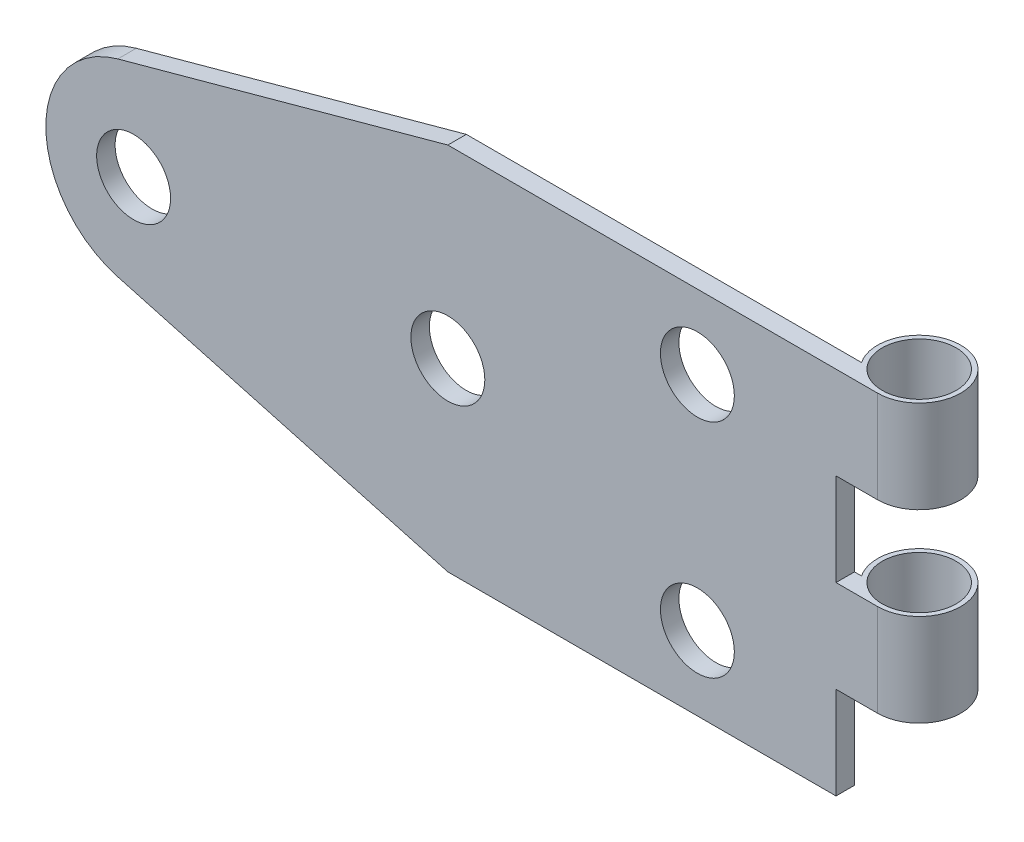
ISO-10303-21;
HEADER;
FILE_DESCRIPTION(('STEP AP214'),'2;1');
FILE_NAME('part.step','',(''),(''),'','','');
FILE_SCHEMA(('AUTOMOTIVE_DESIGN { 1 0 10303 214 1 1 1 1 }'));
ENDSEC;
DATA;
#1=APPLICATION_CONTEXT('core data for automotive mechanical design processes');
#2=APPLICATION_PROTOCOL_DEFINITION('international standard','automotive_design',2000,#1);
#3=PRODUCT_CONTEXT('',#1,'mechanical');
#4=PRODUCT('Part','Part','',(#3));
#5=PRODUCT_RELATED_PRODUCT_CATEGORY('part','',(#4));
#6=PRODUCT_DEFINITION_FORMATION('','',#4);
#7=PRODUCT_DEFINITION_CONTEXT('part definition',#1,'design');
#8=PRODUCT_DEFINITION('design','',#6,#7);
#9=PRODUCT_DEFINITION_SHAPE('','',#8);
#10=(LENGTH_UNIT() NAMED_UNIT(*) SI_UNIT(.MILLI.,.METRE.));
#11=(NAMED_UNIT(*) PLANE_ANGLE_UNIT() SI_UNIT($,.RADIAN.));
#12=(NAMED_UNIT(*) SI_UNIT($,.STERADIAN.) SOLID_ANGLE_UNIT());
#13=UNCERTAINTY_MEASURE_WITH_UNIT(LENGTH_MEASURE(1.E-05),#10,'distance_accuracy_value','');
#14=(GEOMETRIC_REPRESENTATION_CONTEXT(3) GLOBAL_UNCERTAINTY_ASSIGNED_CONTEXT((#13)) GLOBAL_UNIT_ASSIGNED_CONTEXT((#10,
#11,#12)) REPRESENTATION_CONTEXT('',''));
#15=CARTESIAN_POINT('',(0.,0.,0.));
#16=DIRECTION('',(0.,0.,1.));
#17=DIRECTION('',(1.,0.,0.));
#18=AXIS2_PLACEMENT_3D('',#15,#16,#17);
#19=CARTESIAN_POINT('',(0.,0.,2.));
#20=DIRECTION('',(0.,0.,1.));
#21=DIRECTION('',(1.,0.,0.));
#22=AXIS2_PLACEMENT_3D('',#19,#20,#21);
#23=PLANE('',#22);
#24=CARTESIAN_POINT('',(-19.5,12.,2.));
#25=DIRECTION('',(0.,0.,1.));
#26=DIRECTION('',(1.,0.,0.));
#27=AXIS2_PLACEMENT_3D('',#24,#25,#26);
#28=CIRCLE('',#27,4.);
#29=CARTESIAN_POINT('',(-15.5,12.,2.));
#30=VERTEX_POINT('',#29);
#31=EDGE_CURVE('E172',#30,#30,#28,.T.);
#32=ORIENTED_EDGE('',*,*,#31,.F.);
#33=EDGE_LOOP('',(#32));
#34=FACE_BOUND('',#33,.T.);
#35=CARTESIAN_POINT('',(-46.5,0.,2.));
#36=DIRECTION('',(0.,0.,1.));
#37=DIRECTION('',(1.,0.,0.));
#38=AXIS2_PLACEMENT_3D('',#35,#36,#37);
#39=CIRCLE('',#38,4.00000000000001);
#40=CARTESIAN_POINT('',(-42.5,0.,2.));
#41=VERTEX_POINT('',#40);
#42=EDGE_CURVE('E178',#41,#41,#39,.T.);
#43=ORIENTED_EDGE('',*,*,#42,.F.);
#44=EDGE_LOOP('',(#43));
#45=FACE_BOUND('',#44,.T.);
#46=CARTESIAN_POINT('',(-80.5,0.,2.));
#47=DIRECTION('',(0.,0.,1.));
#48=DIRECTION('',(1.,0.,0.));
#49=AXIS2_PLACEMENT_3D('',#46,#47,#48);
#50=CIRCLE('',#49,4.00000000000001);
#51=CARTESIAN_POINT('',(-76.5,0.,2.));
#52=VERTEX_POINT('',#51);
#53=EDGE_CURVE('E173',#52,#52,#50,.T.);
#54=ORIENTED_EDGE('',*,*,#53,.F.);
#55=EDGE_LOOP('',(#54));
#56=FACE_BOUND('',#55,.T.);
#57=CARTESIAN_POINT('',(-19.5,-12.,2.));
#58=DIRECTION('',(0.,0.,1.));
#59=DIRECTION('',(1.,0.,0.));
#60=AXIS2_PLACEMENT_3D('',#57,#58,#59);
#61=CIRCLE('',#60,4.);
#62=CARTESIAN_POINT('',(-15.5,-12.,2.));
#63=VERTEX_POINT('',#62);
#64=EDGE_CURVE('E180',#63,#63,#61,.T.);
#65=ORIENTED_EDGE('',*,*,#64,.F.);
#66=EDGE_LOOP('',(#65));
#67=FACE_BOUND('',#66,.T.);
#68=DIRECTION('',(-1.,0.,0.));
#69=VECTOR('',#68,1.);
#70=CARTESIAN_POINT('',(-4.5,-10.,2.));
#71=LINE('',#70,#69);
#72=CARTESIAN_POINT('',(0.,-10.,2.));
#73=VERTEX_POINT('',#72);
#74=CARTESIAN_POINT('',(-4.5,-10.,2.));
#75=VERTEX_POINT('',#74);
#76=EDGE_CURVE('E189',#73,#75,#71,.T.);
#77=ORIENTED_EDGE('',*,*,#76,.F.);
#78=DIRECTION('',(0.,-1.,0.));
#79=VECTOR('',#78,1.);
#80=CARTESIAN_POINT('',(0.,20.,2.));
#81=LINE('',#80,#79);
#82=CARTESIAN_POINT('',(0.,0.,2.));
#83=VERTEX_POINT('',#82);
#84=EDGE_CURVE('E166',#83,#73,#81,.T.);
#85=ORIENTED_EDGE('',*,*,#84,.F.);
#86=DIRECTION('',(1.,0.,0.));
#87=VECTOR('',#86,1.);
#88=CARTESIAN_POINT('',(-4.5,0.,2.));
#89=LINE('',#88,#87);
#90=CARTESIAN_POINT('',(-4.5,0.,2.));
#91=VERTEX_POINT('',#90);
#92=EDGE_CURVE('E160',#91,#83,#89,.T.);
#93=ORIENTED_EDGE('',*,*,#92,.F.);
#94=DIRECTION('',(0.,-1.,0.));
#95=VECTOR('',#94,1.);
#96=CARTESIAN_POINT('',(-4.5,10.,2.));
#97=LINE('',#96,#95);
#98=CARTESIAN_POINT('',(-4.5,10.,2.));
#99=VERTEX_POINT('',#98);
#100=EDGE_CURVE('E150',#99,#91,#97,.T.);
#101=ORIENTED_EDGE('',*,*,#100,.F.);
#102=DIRECTION('',(-1.,0.,0.));
#103=VECTOR('',#102,1.);
#104=CARTESIAN_POINT('',(0.,10.,2.));
#105=LINE('',#104,#103);
#106=CARTESIAN_POINT('',(0.,10.,2.));
#107=VERTEX_POINT('',#106);
#108=EDGE_CURVE('E156',#107,#99,#105,.T.);
#109=ORIENTED_EDGE('',*,*,#108,.F.);
#110=CARTESIAN_POINT('',(0.,20.,2.));
#111=VERTEX_POINT('',#110);
#112=EDGE_CURVE('E219',#111,#107,#81,.T.);
#113=ORIENTED_EDGE('',*,*,#112,.F.);
#114=DIRECTION('',(-1.,0.,0.));
#115=VECTOR('',#114,1.);
#116=CARTESIAN_POINT('',(0.,20.,2.));
#117=LINE('',#116,#115);
#118=CARTESIAN_POINT('',(-46.5,20.,2.));
#119=VERTEX_POINT('',#118);
#120=EDGE_CURVE('E61',#111,#119,#117,.T.);
#121=ORIENTED_EDGE('',*,*,#120,.T.);
#122=DIRECTION('',(-0.964424622842345,-0.264357989959452,0.));
#123=VECTOR('',#122,1.);
#124=CARTESIAN_POINT('',(-8.34872642401626,30.4576280593252,2.));
#125=LINE('',#124,#123);
#126=CARTESIAN_POINT('',(-82.2110801063892,10.2112522507119,2.));
#127=VERTEX_POINT('',#126);
#128=EDGE_CURVE('E224',#119,#127,#125,.T.);
#129=ORIENTED_EDGE('',*,*,#128,.T.);
#130=CARTESIAN_POINT('',(-79.4120784467143,0.,2.));
#131=DIRECTION('',(0.,0.,1.));
#132=DIRECTION('',(1.,0.,0.));
#133=AXIS2_PLACEMENT_3D('',#130,#131,#132);
#134=CIRCLE('',#133,10.5879215532857);
#135=CARTESIAN_POINT('',(-82.2110801063892,-10.2112522507119,2.));
#136=VERTEX_POINT('',#135);
#137=EDGE_CURVE('E97',#127,#136,#134,.T.);
#138=ORIENTED_EDGE('',*,*,#137,.T.);
#139=DIRECTION('',(-0.964424622842345,0.264357989959451,0.));
#140=VECTOR('',#139,1.);
#141=CARTESIAN_POINT('',(-8.34872642401625,-30.4576280593252,2.));
#142=LINE('',#141,#140);
#143=CARTESIAN_POINT('',(-46.5,-20.,2.));
#144=VERTEX_POINT('',#143);
#145=EDGE_CURVE('E226',#144,#136,#142,.T.);
#146=ORIENTED_EDGE('',*,*,#145,.F.);
#147=DIRECTION('',(-1.,0.,0.));
#148=VECTOR('',#147,1.);
#149=CARTESIAN_POINT('',(0.,-20.,2.));
#150=LINE('',#149,#148);
#151=CARTESIAN_POINT('',(-4.5,-20.,2.));
#152=VERTEX_POINT('',#151);
#153=EDGE_CURVE('E233',#152,#144,#150,.T.);
#154=ORIENTED_EDGE('',*,*,#153,.F.);
#155=DIRECTION('',(0.,-1.,0.));
#156=VECTOR('',#155,1.);
#157=CARTESIAN_POINT('',(-4.5,-20.,2.));
#158=LINE('',#157,#156);
#159=EDGE_CURVE('E187',#75,#152,#158,.T.);
#160=ORIENTED_EDGE('',*,*,#159,.F.);
#161=EDGE_LOOP('',(#77,#85,#93,#101,#109,#113,#121,#129,#138,#146,#154,#160));
#162=FACE_BOUND('',#161,.T.);
#163=ADVANCED_FACE('F44',(#34,#45,#56,#67,#162),#23,.T.);
#164=CARTESIAN_POINT('',(0.,20.,-2.5));
#165=DIRECTION('',(0.,-1.,0.));
#166=DIRECTION('',(0.,0.,-1.));
#167=AXIS2_PLACEMENT_3D('',#164,#165,#166);
#168=CYLINDRICAL_SURFACE('',#167,4.5);
#169=CARTESIAN_POINT('',(0.,-10.,-2.5));
#170=DIRECTION('',(0.,-1.,0.));
#171=DIRECTION('',(0.,0.,-1.));
#172=AXIS2_PLACEMENT_3D('',#169,#170,#171);
#173=CIRCLE('',#172,4.5);
#174=CARTESIAN_POINT('',(-3.74165738677394,-10.,0.));
#175=VERTEX_POINT('',#174);
#176=EDGE_CURVE('E205',#175,#73,#173,.T.);
#177=ORIENTED_EDGE('',*,*,#176,.F.);
#178=DIRECTION('',(0.,-1.,0.));
#179=VECTOR('',#178,1.);
#180=CARTESIAN_POINT('',(-3.74165738677394,20.,0.));
#181=LINE('',#180,#179);
#182=CARTESIAN_POINT('',(-3.74165738677394,0.,0.));
#183=VERTEX_POINT('',#182);
#184=EDGE_CURVE('E216',#183,#175,#181,.T.);
#185=ORIENTED_EDGE('',*,*,#184,.F.);
#186=CARTESIAN_POINT('',(0.,0.,-2.5));
#187=DIRECTION('',(0.,1.,0.));
#188=DIRECTION('',(0.,0.,1.));
#189=AXIS2_PLACEMENT_3D('',#186,#187,#188);
#190=CIRCLE('',#189,4.5);
#191=EDGE_CURVE('E197',#83,#183,#190,.T.);
#192=ORIENTED_EDGE('',*,*,#191,.F.);
#193=ORIENTED_EDGE('',*,*,#84,.T.);
#194=EDGE_LOOP('',(#177,#185,#192,#193));
#195=FACE_BOUND('',#194,.T.);
#196=ADVANCED_FACE('F294',(#195),#168,.T.);
#197=CARTESIAN_POINT('',(0.,10.,-2.5));
#198=DIRECTION('',(0.,-1.,0.));
#199=DIRECTION('',(1.,0.,0.));
#200=AXIS2_PLACEMENT_3D('',#197,#198,#199);
#201=CIRCLE('',#200,4.5);
#202=CARTESIAN_POINT('',(-3.74165738677394,10.,0.));
#203=VERTEX_POINT('',#202);
#204=EDGE_CURVE('E194',#203,#107,#201,.T.);
#205=ORIENTED_EDGE('',*,*,#204,.F.);
#206=CARTESIAN_POINT('',(-3.74165738677394,20.,0.));
#207=VERTEX_POINT('',#206);
#208=EDGE_CURVE('E221',#207,#203,#181,.T.);
#209=ORIENTED_EDGE('',*,*,#208,.F.);
#210=CARTESIAN_POINT('',(0.,20.,-2.5));
#211=DIRECTION('',(0.,1.,0.));
#212=DIRECTION('',(0.,0.,1.));
#213=AXIS2_PLACEMENT_3D('',#210,#211,#212);
#214=CIRCLE('',#213,4.5);
#215=EDGE_CURVE('E213',#111,#207,#214,.T.);
#216=ORIENTED_EDGE('',*,*,#215,.F.);
#217=ORIENTED_EDGE('',*,*,#112,.T.);
#218=EDGE_LOOP('',(#205,#209,#216,#217));
#219=FACE_BOUND('',#218,.T.);
#220=ADVANCED_FACE('F305',(#219),#168,.T.);
#221=CARTESIAN_POINT('',(0.,20.,-2.5));
#222=DIRECTION('',(0.,-1.,0.));
#223=DIRECTION('',(0.,0.,-1.));
#224=AXIS2_PLACEMENT_3D('',#221,#222,#223);
#225=CYLINDRICAL_SURFACE('',#224,4.);
#226=CARTESIAN_POINT('',(0.,20.,-2.5));
#227=DIRECTION('',(0.,1.,0.));
#228=DIRECTION('',(0.,0.,1.));
#229=AXIS2_PLACEMENT_3D('',#226,#227,#228);
#230=CIRCLE('',#229,4.);
#231=CARTESIAN_POINT('',(0.,20.,1.5));
#232=VERTEX_POINT('',#231);
#233=EDGE_CURVE('E215',#232,#232,#230,.T.);
#234=ORIENTED_EDGE('',*,*,#233,.T.);
#235=EDGE_LOOP('',(#234));
#236=FACE_BOUND('',#235,.T.);
#237=CARTESIAN_POINT('',(0.,10.,-2.5));
#238=DIRECTION('',(0.,-1.,0.));
#239=DIRECTION('',(1.,0.,0.));
#240=AXIS2_PLACEMENT_3D('',#237,#238,#239);
#241=CIRCLE('',#240,4.);
#242=CARTESIAN_POINT('',(4.,10.,-2.5));
#243=VERTEX_POINT('',#242);
#244=EDGE_CURVE('E195',#243,#243,#241,.T.);
#245=ORIENTED_EDGE('',*,*,#244,.T.);
#246=EDGE_LOOP('',(#245));
#247=FACE_BOUND('',#246,.T.);
#248=ADVANCED_FACE('F325',(#236,#247),#225,.F.);
#249=CARTESIAN_POINT('',(-8.34872642401626,30.4576280593252,2.));
#250=DIRECTION('',(0.264357989959452,-0.964424622842345,0.));
#251=DIRECTION('',(0.964424622842345,0.264357989959452,0.));
#252=AXIS2_PLACEMENT_3D('',#249,#250,#251);
#253=PLANE('',#252);
#254=DIRECTION('',(-0.964424622842345,-0.264357989959452,0.));
#255=VECTOR('',#254,1.);
#256=CARTESIAN_POINT('',(-8.34872642401626,30.4576280593252,0.));
#257=LINE('',#256,#255);
#258=CARTESIAN_POINT('',(-46.5,20.,0.));
#259=VERTEX_POINT('',#258);
#260=CARTESIAN_POINT('',(-82.2110801063892,10.2112522507119,0.));
#261=VERTEX_POINT('',#260);
#262=EDGE_CURVE('E222',#259,#261,#257,.T.);
#263=ORIENTED_EDGE('',*,*,#262,.T.);
#264=DIRECTION('',(0.,0.,-1.));
#265=VECTOR('',#264,1.);
#266=CARTESIAN_POINT('',(-82.2110801063892,10.2112522507119,2.));
#267=LINE('',#266,#265);
#268=EDGE_CURVE('E11',#127,#261,#267,.T.);
#269=ORIENTED_EDGE('',*,*,#268,.F.);
#270=ORIENTED_EDGE('',*,*,#128,.F.);
#271=DIRECTION('',(0.,0.,-1.));
#272=VECTOR('',#271,1.);
#273=CARTESIAN_POINT('',(-46.5,20.,2.));
#274=LINE('',#273,#272);
#275=EDGE_CURVE('E234',#119,#259,#274,.T.);
#276=ORIENTED_EDGE('',*,*,#275,.T.);
#277=EDGE_LOOP('',(#263,#269,#270,#276));
#278=FACE_BOUND('',#277,.T.);
#279=ADVANCED_FACE('F50',(#278),#253,.F.);
#280=CARTESIAN_POINT('',(-79.4120784467143,0.,2.));
#281=DIRECTION('',(0.,0.,-1.));
#282=DIRECTION('',(-1.,0.,0.));
#283=AXIS2_PLACEMENT_3D('',#280,#281,#282);
#284=CYLINDRICAL_SURFACE('',#283,10.5879215532857);
#285=CARTESIAN_POINT('',(-79.4120784467143,0.,0.));
#286=DIRECTION('',(0.,0.,1.));
#287=DIRECTION('',(1.,0.,0.));
#288=AXIS2_PLACEMENT_3D('',#285,#286,#287);
#289=CIRCLE('',#288,10.5879215532857);
#290=CARTESIAN_POINT('',(-82.2110801063892,-10.2112522507119,0.));
#291=VERTEX_POINT('',#290);
#292=EDGE_CURVE('E240',#261,#291,#289,.T.);
#293=ORIENTED_EDGE('',*,*,#292,.T.);
#294=DIRECTION('',(0.,0.,-1.));
#295=VECTOR('',#294,1.);
#296=CARTESIAN_POINT('',(-82.2110801063892,-10.2112522507119,2.));
#297=LINE('',#296,#295);
#298=EDGE_CURVE('E54',#136,#291,#297,.T.);
#299=ORIENTED_EDGE('',*,*,#298,.F.);
#300=ORIENTED_EDGE('',*,*,#137,.F.);
#301=ORIENTED_EDGE('',*,*,#268,.T.);
#302=EDGE_LOOP('',(#293,#299,#300,#301));
#303=FACE_BOUND('',#302,.T.);
#304=ADVANCED_FACE('F317',(#303),#284,.T.);
#305=CARTESIAN_POINT('',(-8.34872642401625,-30.4576280593252,2.));
#306=DIRECTION('',(-0.264357989959451,-0.964424622842345,0.));
#307=DIRECTION('',(0.964424622842345,-0.264357989959451,0.));
#308=AXIS2_PLACEMENT_3D('',#305,#306,#307);
#309=PLANE('',#308);
#310=DIRECTION('',(-0.964424622842345,0.264357989959451,0.));
#311=VECTOR('',#310,1.);
#312=CARTESIAN_POINT('',(-8.34872642401625,-30.4576280593252,0.));
#313=LINE('',#312,#311);
#314=CARTESIAN_POINT('',(-46.5,-20.,0.));
#315=VERTEX_POINT('',#314);
#316=EDGE_CURVE('E239',#315,#291,#313,.T.);
#317=ORIENTED_EDGE('',*,*,#316,.F.);
#318=DIRECTION('',(0.,0.,-1.));
#319=VECTOR('',#318,1.);
#320=CARTESIAN_POINT('',(-46.5,-20.,2.));
#321=LINE('',#320,#319);
#322=EDGE_CURVE('E244',#144,#315,#321,.T.);
#323=ORIENTED_EDGE('',*,*,#322,.F.);
#324=ORIENTED_EDGE('',*,*,#145,.T.);
#325=ORIENTED_EDGE('',*,*,#298,.T.);
#326=EDGE_LOOP('',(#317,#323,#324,#325));
#327=FACE_BOUND('',#326,.T.);
#328=ADVANCED_FACE('F312',(#327),#309,.T.);
#329=CARTESIAN_POINT('',(0.,-20.,2.));
#330=DIRECTION('',(0.,-1.,0.));
#331=DIRECTION('',(1.,0.,0.));
#332=AXIS2_PLACEMENT_3D('',#329,#330,#331);
#333=PLANE('',#332);
#334=DIRECTION('',(0.,0.,-1.));
#335=VECTOR('',#334,1.);
#336=CARTESIAN_POINT('',(-4.5,-20.,2.));
#337=LINE('',#336,#335);
#338=CARTESIAN_POINT('',(-4.5,-20.,0.));
#339=VERTEX_POINT('',#338);
#340=EDGE_CURVE('E183',#152,#339,#337,.T.);
#341=ORIENTED_EDGE('',*,*,#340,.F.);
#342=ORIENTED_EDGE('',*,*,#153,.T.);
#343=ORIENTED_EDGE('',*,*,#322,.T.);
#344=DIRECTION('',(-1.,0.,0.));
#345=VECTOR('',#344,1.);
#346=CARTESIAN_POINT('',(0.,-20.,0.));
#347=LINE('',#346,#345);
#348=EDGE_CURVE('E84',#339,#315,#347,.T.);
#349=ORIENTED_EDGE('',*,*,#348,.F.);
#350=EDGE_LOOP('',(#341,#342,#343,#349));
#351=FACE_BOUND('',#350,.T.);
#352=ADVANCED_FACE('F309',(#351),#333,.T.);
#353=CARTESIAN_POINT('',(0.,20.,2.));
#354=DIRECTION('',(0.,-1.,0.));
#355=DIRECTION('',(1.,0.,0.));
#356=AXIS2_PLACEMENT_3D('',#353,#354,#355);
#357=PLANE('',#356);
#358=DIRECTION('',(-1.,0.,0.));
#359=VECTOR('',#358,1.);
#360=CARTESIAN_POINT('',(0.,20.,0.));
#361=LINE('',#360,#359);
#362=EDGE_CURVE('E86',#207,#259,#361,.T.);
#363=ORIENTED_EDGE('',*,*,#362,.T.);
#364=ORIENTED_EDGE('',*,*,#275,.F.);
#365=ORIENTED_EDGE('',*,*,#120,.F.);
#366=ORIENTED_EDGE('',*,*,#215,.T.);
#367=EDGE_LOOP('',(#363,#364,#365,#366));
#368=FACE_BOUND('',#367,.T.);
#369=ORIENTED_EDGE('',*,*,#233,.F.);
#370=EDGE_LOOP('',(#369));
#371=FACE_BOUND('',#370,.T.);
#372=ADVANCED_FACE('F269',(#368,#371),#357,.F.);
#373=CARTESIAN_POINT('',(0.,0.,0.));
#374=DIRECTION('',(0.,0.,1.));
#375=DIRECTION('',(1.,0.,0.));
#376=AXIS2_PLACEMENT_3D('',#373,#374,#375);
#377=PLANE('',#376);
#378=DIRECTION('',(0.,1.,0.));
#379=VECTOR('',#378,1.);
#380=CARTESIAN_POINT('',(-4.5,0.,0.));
#381=LINE('',#380,#379);
#382=CARTESIAN_POINT('',(-4.5,-10.,0.));
#383=VERTEX_POINT('',#382);
#384=EDGE_CURVE('E209',#339,#383,#381,.T.);
#385=ORIENTED_EDGE('',*,*,#384,.F.);
#386=ORIENTED_EDGE('',*,*,#348,.T.);
#387=ORIENTED_EDGE('',*,*,#316,.T.);
#388=ORIENTED_EDGE('',*,*,#292,.F.);
#389=ORIENTED_EDGE('',*,*,#262,.F.);
#390=ORIENTED_EDGE('',*,*,#362,.F.);
#391=ORIENTED_EDGE('',*,*,#208,.T.);
#392=DIRECTION('',(1.,0.,0.));
#393=VECTOR('',#392,1.);
#394=CARTESIAN_POINT('',(0.,10.,0.));
#395=LINE('',#394,#393);
#396=CARTESIAN_POINT('',(-4.5,10.,0.));
#397=VERTEX_POINT('',#396);
#398=EDGE_CURVE('E193',#397,#203,#395,.T.);
#399=ORIENTED_EDGE('',*,*,#398,.F.);
#400=DIRECTION('',(0.,1.,0.));
#401=VECTOR('',#400,1.);
#402=CARTESIAN_POINT('',(-4.5,0.,0.));
#403=LINE('',#402,#401);
#404=CARTESIAN_POINT('',(-4.5,0.,0.));
#405=VERTEX_POINT('',#404);
#406=EDGE_CURVE('E202',#405,#397,#403,.T.);
#407=ORIENTED_EDGE('',*,*,#406,.F.);
#408=DIRECTION('',(-1.,0.,0.));
#409=VECTOR('',#408,1.);
#410=CARTESIAN_POINT('',(0.,0.,0.));
#411=LINE('',#410,#409);
#412=EDGE_CURVE('E165',#183,#405,#411,.T.);
#413=ORIENTED_EDGE('',*,*,#412,.F.);
#414=ORIENTED_EDGE('',*,*,#184,.T.);
#415=DIRECTION('',(1.,0.,0.));
#416=VECTOR('',#415,1.);
#417=CARTESIAN_POINT('',(0.,-10.,0.));
#418=LINE('',#417,#416);
#419=EDGE_CURVE('E204',#383,#175,#418,.T.);
#420=ORIENTED_EDGE('',*,*,#419,.F.);
#421=EDGE_LOOP('',(#385,#386,#387,#388,#389,#390,#391,#399,#407,#413,#414,#420));
#422=FACE_BOUND('',#421,.T.);
#423=CARTESIAN_POINT('',(-19.5,12.,0.));
#424=DIRECTION('',(0.,0.,1.));
#425=DIRECTION('',(1.,0.,0.));
#426=AXIS2_PLACEMENT_3D('',#423,#424,#425);
#427=CIRCLE('',#426,4.);
#428=CARTESIAN_POINT('',(-15.5,12.,0.));
#429=VERTEX_POINT('',#428);
#430=EDGE_CURVE('E47',#429,#429,#427,.F.);
#431=ORIENTED_EDGE('',*,*,#430,.F.);
#432=EDGE_LOOP('',(#431));
#433=FACE_BOUND('',#432,.T.);
#434=CARTESIAN_POINT('',(-46.5,0.,0.));
#435=DIRECTION('',(0.,0.,1.));
#436=DIRECTION('',(1.,0.,0.));
#437=AXIS2_PLACEMENT_3D('',#434,#435,#436);
#438=CIRCLE('',#437,4.00000000000001);
#439=CARTESIAN_POINT('',(-42.5,0.,0.));
#440=VERTEX_POINT('',#439);
#441=EDGE_CURVE('E259',#440,#440,#438,.F.);
#442=ORIENTED_EDGE('',*,*,#441,.F.);
#443=EDGE_LOOP('',(#442));
#444=FACE_BOUND('',#443,.T.);
#445=CARTESIAN_POINT('',(-80.5,0.,0.));
#446=DIRECTION('',(0.,0.,1.));
#447=DIRECTION('',(1.,0.,0.));
#448=AXIS2_PLACEMENT_3D('',#445,#446,#447);
#449=CIRCLE('',#448,4.00000000000001);
#450=CARTESIAN_POINT('',(-76.5,0.,0.));
#451=VERTEX_POINT('',#450);
#452=EDGE_CURVE('E257',#451,#451,#449,.F.);
#453=ORIENTED_EDGE('',*,*,#452,.F.);
#454=EDGE_LOOP('',(#453));
#455=FACE_BOUND('',#454,.T.);
#456=CARTESIAN_POINT('',(-19.5,-12.,0.));
#457=DIRECTION('',(0.,0.,1.));
#458=DIRECTION('',(1.,0.,0.));
#459=AXIS2_PLACEMENT_3D('',#456,#457,#458);
#460=CIRCLE('',#459,4.);
#461=CARTESIAN_POINT('',(-15.5,-12.,0.));
#462=VERTEX_POINT('',#461);
#463=EDGE_CURVE('E212',#462,#462,#460,.F.);
#464=ORIENTED_EDGE('',*,*,#463,.F.);
#465=EDGE_LOOP('',(#464));
#466=FACE_BOUND('',#465,.T.);
#467=ADVANCED_FACE('F270',(#422,#433,#444,#455,#466),#377,.F.);
#468=CARTESIAN_POINT('',(-4.5,10.,2.));
#469=DIRECTION('',(1.,0.,0.));
#470=DIRECTION('',(0.,0.,-1.));
#471=AXIS2_PLACEMENT_3D('',#468,#469,#470);
#472=PLANE('',#471);
#473=ORIENTED_EDGE('',*,*,#406,.T.);
#474=DIRECTION('',(0.,0.,-1.));
#475=VECTOR('',#474,1.);
#476=CARTESIAN_POINT('',(-4.5,10.,2.));
#477=LINE('',#476,#475);
#478=EDGE_CURVE('E152',#99,#397,#477,.T.);
#479=ORIENTED_EDGE('',*,*,#478,.F.);
#480=ORIENTED_EDGE('',*,*,#100,.T.);
#481=DIRECTION('',(0.,0.,-1.));
#482=VECTOR('',#481,1.);
#483=CARTESIAN_POINT('',(-4.5,0.,2.));
#484=LINE('',#483,#482);
#485=EDGE_CURVE('E148',#91,#405,#484,.T.);
#486=ORIENTED_EDGE('',*,*,#485,.T.);
#487=EDGE_LOOP('',(#473,#479,#480,#486));
#488=FACE_BOUND('',#487,.T.);
#489=ADVANCED_FACE('F146',(#488),#472,.T.);
#490=CARTESIAN_POINT('',(-4.5,0.,2.));
#491=DIRECTION('',(0.,1.,0.));
#492=DIRECTION('',(0.,0.,1.));
#493=AXIS2_PLACEMENT_3D('',#490,#491,#492);
#494=PLANE('',#493);
#495=CARTESIAN_POINT('',(0.,0.,-2.5));
#496=DIRECTION('',(0.,1.,0.));
#497=DIRECTION('',(0.,0.,1.));
#498=AXIS2_PLACEMENT_3D('',#495,#496,#497);
#499=CIRCLE('',#498,4.);
#500=CARTESIAN_POINT('',(0.,0.,1.5));
#501=VERTEX_POINT('',#500);
#502=EDGE_CURVE('E199',#501,#501,#499,.T.);
#503=ORIENTED_EDGE('',*,*,#502,.F.);
#504=EDGE_LOOP('',(#503));
#505=FACE_BOUND('',#504,.T.);
#506=ORIENTED_EDGE('',*,*,#412,.T.);
#507=ORIENTED_EDGE('',*,*,#485,.F.);
#508=ORIENTED_EDGE('',*,*,#92,.T.);
#509=ORIENTED_EDGE('',*,*,#191,.T.);
#510=EDGE_LOOP('',(#506,#507,#508,#509));
#511=FACE_BOUND('',#510,.T.);
#512=ADVANCED_FACE('F163',(#505,#511),#494,.T.);
#513=CARTESIAN_POINT('',(0.,10.,2.));
#514=DIRECTION('',(0.,-1.,0.));
#515=DIRECTION('',(1.,0.,0.));
#516=AXIS2_PLACEMENT_3D('',#513,#514,#515);
#517=PLANE('',#516);
#518=ORIENTED_EDGE('',*,*,#244,.F.);
#519=EDGE_LOOP('',(#518));
#520=FACE_BOUND('',#519,.T.);
#521=ORIENTED_EDGE('',*,*,#398,.T.);
#522=ORIENTED_EDGE('',*,*,#204,.T.);
#523=ORIENTED_EDGE('',*,*,#108,.T.);
#524=ORIENTED_EDGE('',*,*,#478,.T.);
#525=EDGE_LOOP('',(#521,#522,#523,#524));
#526=FACE_BOUND('',#525,.T.);
#527=ADVANCED_FACE('F339',(#520,#526),#517,.T.);
#528=ORIENTED_EDGE('',*,*,#502,.T.);
#529=EDGE_LOOP('',(#528));
#530=FACE_BOUND('',#529,.T.);
#531=CARTESIAN_POINT('',(0.,-10.,-2.5));
#532=DIRECTION('',(0.,-1.,0.));
#533=DIRECTION('',(0.,0.,-1.));
#534=AXIS2_PLACEMENT_3D('',#531,#532,#533);
#535=CIRCLE('',#534,4.);
#536=CARTESIAN_POINT('',(0.,-10.,-6.5));
#537=VERTEX_POINT('',#536);
#538=EDGE_CURVE('E201',#537,#537,#535,.T.);
#539=ORIENTED_EDGE('',*,*,#538,.T.);
#540=EDGE_LOOP('',(#539));
#541=FACE_BOUND('',#540,.T.);
#542=ADVANCED_FACE('F310',(#530,#541),#225,.F.);
#543=CARTESIAN_POINT('',(-4.5,-20.,2.));
#544=DIRECTION('',(1.,0.,0.));
#545=DIRECTION('',(0.,0.,-1.));
#546=AXIS2_PLACEMENT_3D('',#543,#544,#545);
#547=PLANE('',#546);
#548=ORIENTED_EDGE('',*,*,#384,.T.);
#549=DIRECTION('',(0.,0.,-1.));
#550=VECTOR('',#549,1.);
#551=CARTESIAN_POINT('',(-4.5,-10.,2.));
#552=LINE('',#551,#550);
#553=EDGE_CURVE('E181',#75,#383,#552,.T.);
#554=ORIENTED_EDGE('',*,*,#553,.F.);
#555=ORIENTED_EDGE('',*,*,#159,.T.);
#556=ORIENTED_EDGE('',*,*,#340,.T.);
#557=EDGE_LOOP('',(#548,#554,#555,#556));
#558=FACE_BOUND('',#557,.T.);
#559=ADVANCED_FACE('F289',(#558),#547,.T.);
#560=CARTESIAN_POINT('',(0.,-10.,2.));
#561=DIRECTION('',(0.,-1.,0.));
#562=DIRECTION('',(0.,0.,-1.));
#563=AXIS2_PLACEMENT_3D('',#560,#561,#562);
#564=PLANE('',#563);
#565=ORIENTED_EDGE('',*,*,#538,.F.);
#566=EDGE_LOOP('',(#565));
#567=FACE_BOUND('',#566,.T.);
#568=ORIENTED_EDGE('',*,*,#176,.T.);
#569=ORIENTED_EDGE('',*,*,#76,.T.);
#570=ORIENTED_EDGE('',*,*,#553,.T.);
#571=ORIENTED_EDGE('',*,*,#419,.T.);
#572=EDGE_LOOP('',(#568,#569,#570,#571));
#573=FACE_BOUND('',#572,.T.);
#574=ADVANCED_FACE('F278',(#567,#573),#564,.T.);
#575=CARTESIAN_POINT('',(-19.5,-12.,2.));
#576=DIRECTION('',(0.,0.,-1.));
#577=DIRECTION('',(-1.,0.,0.));
#578=AXIS2_PLACEMENT_3D('',#575,#576,#577);
#579=CYLINDRICAL_SURFACE('',#578,4.);
#580=ORIENTED_EDGE('',*,*,#64,.T.);
#581=EDGE_LOOP('',(#580));
#582=FACE_BOUND('',#581,.T.);
#583=ORIENTED_EDGE('',*,*,#463,.T.);
#584=EDGE_LOOP('',(#583));
#585=FACE_BOUND('',#584,.T.);
#586=ADVANCED_FACE('F280',(#582,#585),#579,.F.);
#587=CARTESIAN_POINT('',(-80.5,0.,2.));
#588=DIRECTION('',(0.,0.,-1.));
#589=DIRECTION('',(-1.,0.,0.));
#590=AXIS2_PLACEMENT_3D('',#587,#588,#589);
#591=CYLINDRICAL_SURFACE('',#590,4.00000000000001);
#592=ORIENTED_EDGE('',*,*,#53,.T.);
#593=EDGE_LOOP('',(#592));
#594=FACE_BOUND('',#593,.T.);
#595=ORIENTED_EDGE('',*,*,#452,.T.);
#596=EDGE_LOOP('',(#595));
#597=FACE_BOUND('',#596,.T.);
#598=ADVANCED_FACE('F276',(#594,#597),#591,.F.);
#599=CARTESIAN_POINT('',(-46.5,0.,2.));
#600=DIRECTION('',(0.,0.,-1.));
#601=DIRECTION('',(-1.,0.,0.));
#602=AXIS2_PLACEMENT_3D('',#599,#600,#601);
#603=CYLINDRICAL_SURFACE('',#602,4.00000000000001);
#604=ORIENTED_EDGE('',*,*,#42,.T.);
#605=EDGE_LOOP('',(#604));
#606=FACE_BOUND('',#605,.T.);
#607=ORIENTED_EDGE('',*,*,#441,.T.);
#608=EDGE_LOOP('',(#607));
#609=FACE_BOUND('',#608,.T.);
#610=ADVANCED_FACE('F290',(#606,#609),#603,.F.);
#611=CARTESIAN_POINT('',(-19.5,12.,2.));
#612=DIRECTION('',(0.,0.,-1.));
#613=DIRECTION('',(-1.,0.,0.));
#614=AXIS2_PLACEMENT_3D('',#611,#612,#613);
#615=CYLINDRICAL_SURFACE('',#614,4.);
#616=ORIENTED_EDGE('',*,*,#31,.T.);
#617=EDGE_LOOP('',(#616));
#618=FACE_BOUND('',#617,.T.);
#619=ORIENTED_EDGE('',*,*,#430,.T.);
#620=EDGE_LOOP('',(#619));
#621=FACE_BOUND('',#620,.T.);
#622=ADVANCED_FACE('F261',(#618,#621),#615,.F.);
#623=CLOSED_SHELL('',(#163,#196,#220,#248,#279,#304,#328,#352,#372,#467,#489,#512,#527,#542,
#559,#574,#586,#598,#610,#622));
#624=MANIFOLD_SOLID_BREP('B2',#623);
#625=ADVANCED_BREP_SHAPE_REPRESENTATION('',(#18,#624),#14);
#626=SHAPE_DEFINITION_REPRESENTATION(#9,#625);
ENDSEC;
END-ISO-10303-21;
